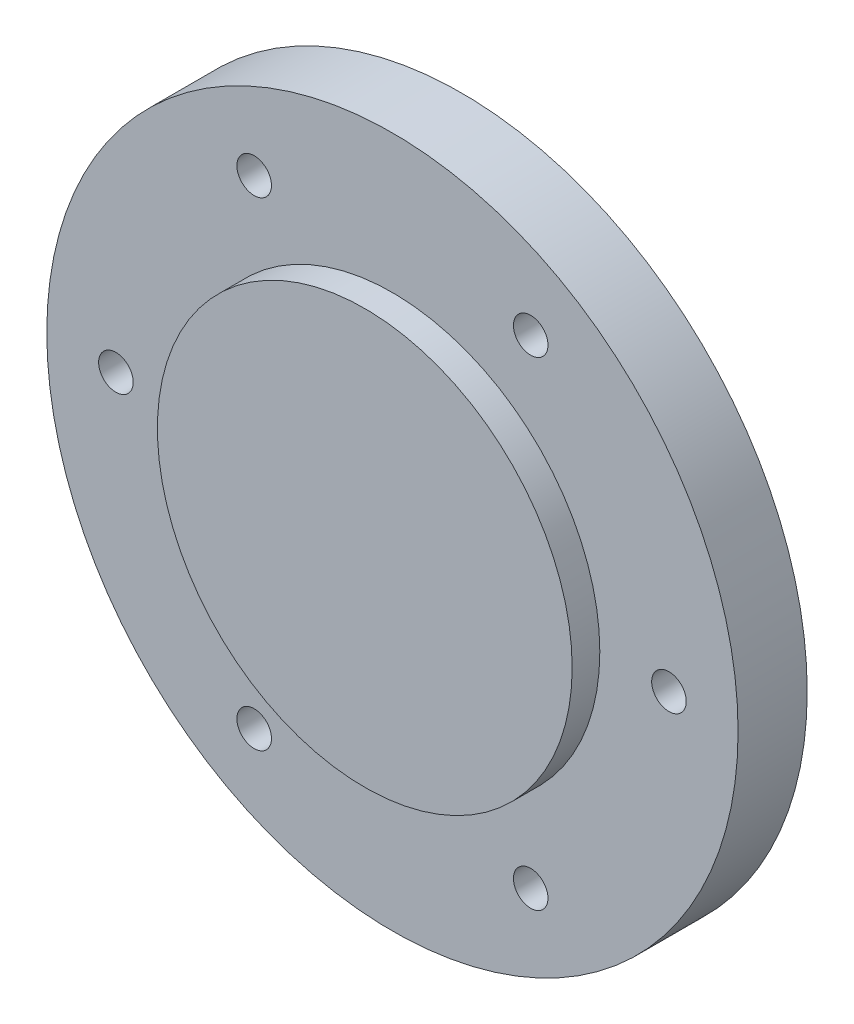
ISO-10303-21;
HEADER;
FILE_DESCRIPTION(('STEP AP214'),'2;1');
FILE_NAME('part.step','',(''),(''),'','','');
FILE_SCHEMA(('AUTOMOTIVE_DESIGN { 1 0 10303 214 1 1 1 1 }'));
ENDSEC;
DATA;
#1=APPLICATION_CONTEXT('core data for automotive mechanical design processes');
#2=APPLICATION_PROTOCOL_DEFINITION('international standard','automotive_design',2000,#1);
#3=PRODUCT_CONTEXT('',#1,'mechanical');
#4=PRODUCT('Part','Part','',(#3));
#5=PRODUCT_RELATED_PRODUCT_CATEGORY('part','',(#4));
#6=PRODUCT_DEFINITION_FORMATION('','',#4);
#7=PRODUCT_DEFINITION_CONTEXT('part definition',#1,'design');
#8=PRODUCT_DEFINITION('design','',#6,#7);
#9=PRODUCT_DEFINITION_SHAPE('','',#8);
#10=(LENGTH_UNIT() NAMED_UNIT(*) SI_UNIT(.MILLI.,.METRE.));
#11=(NAMED_UNIT(*) PLANE_ANGLE_UNIT() SI_UNIT($,.RADIAN.));
#12=(NAMED_UNIT(*) SI_UNIT($,.STERADIAN.) SOLID_ANGLE_UNIT());
#13=UNCERTAINTY_MEASURE_WITH_UNIT(LENGTH_MEASURE(1.E-05),#10,'distance_accuracy_value','');
#14=(GEOMETRIC_REPRESENTATION_CONTEXT(3) GLOBAL_UNCERTAINTY_ASSIGNED_CONTEXT((#13)) GLOBAL_UNIT_ASSIGNED_CONTEXT((#10,
#11,#12)) REPRESENTATION_CONTEXT('',''));
#15=CARTESIAN_POINT('',(0.,0.,0.));
#16=DIRECTION('',(0.,0.,1.));
#17=DIRECTION('',(1.,0.,0.));
#18=AXIS2_PLACEMENT_3D('',#15,#16,#17);
#19=CARTESIAN_POINT('',(0.,0.,5.));
#20=DIRECTION('',(0.,0.,-1.));
#21=DIRECTION('',(-1.,0.,0.));
#22=AXIS2_PLACEMENT_3D('',#19,#20,#21);
#23=CYLINDRICAL_SURFACE('',#22,25.);
#24=CARTESIAN_POINT('',(0.,0.,5.));
#25=DIRECTION('',(0.,0.,1.));
#26=DIRECTION('',(1.,0.,0.));
#27=AXIS2_PLACEMENT_3D('',#24,#25,#26);
#28=CIRCLE('',#27,25.);
#29=CARTESIAN_POINT('',(25.,0.,5.));
#30=VERTEX_POINT('',#29);
#31=EDGE_CURVE('E42',#30,#30,#28,.T.);
#32=ORIENTED_EDGE('',*,*,#31,.F.);
#33=EDGE_LOOP('',(#32));
#34=FACE_BOUND('',#33,.T.);
#35=CARTESIAN_POINT('',(0.,0.,0.));
#36=DIRECTION('',(0.,0.,1.));
#37=DIRECTION('',(1.,0.,0.));
#38=AXIS2_PLACEMENT_3D('',#35,#36,#37);
#39=CIRCLE('',#38,25.);
#40=CARTESIAN_POINT('',(25.,0.,0.));
#41=VERTEX_POINT('',#40);
#42=EDGE_CURVE('E37',#41,#41,#39,.T.);
#43=ORIENTED_EDGE('',*,*,#42,.T.);
#44=EDGE_LOOP('',(#43));
#45=FACE_BOUND('',#44,.T.);
#46=ADVANCED_FACE('F40',(#34,#45),#23,.T.);
#47=CARTESIAN_POINT('',(0.,0.,5.));
#48=DIRECTION('',(0.,0.,1.));
#49=DIRECTION('',(1.,0.,0.));
#50=AXIS2_PLACEMENT_3D('',#47,#48,#49);
#51=PLANE('',#50);
#52=CARTESIAN_POINT('',(9.99999999999999,-17.3205080756888,5.));
#53=DIRECTION('',(0.,0.,1.));
#54=DIRECTION('',(0.499999999999999,-0.866025403784439,0.));
#55=AXIS2_PLACEMENT_3D('',#52,#53,#54);
#56=CIRCLE('',#55,1.25);
#57=CARTESIAN_POINT('',(10.625,-18.4030398304193,5.));
#58=VERTEX_POINT('',#57);
#59=EDGE_CURVE('E66',#58,#58,#56,.T.);
#60=ORIENTED_EDGE('',*,*,#59,.F.);
#61=EDGE_LOOP('',(#60));
#62=FACE_BOUND('',#61,.T.);
#63=CARTESIAN_POINT('',(-10.,-17.3205080756888,5.));
#64=DIRECTION('',(0.,0.,1.));
#65=DIRECTION('',(-0.5,-0.866025403784438,0.));
#66=AXIS2_PLACEMENT_3D('',#63,#64,#65);
#67=CIRCLE('',#66,1.25);
#68=CARTESIAN_POINT('',(-10.625,-18.4030398304193,5.));
#69=VERTEX_POINT('',#68);
#70=EDGE_CURVE('E75',#69,#69,#67,.T.);
#71=ORIENTED_EDGE('',*,*,#70,.F.);
#72=EDGE_LOOP('',(#71));
#73=FACE_BOUND('',#72,.T.);
#74=CARTESIAN_POINT('',(-20.,0.,5.));
#75=DIRECTION('',(0.,0.,1.));
#76=DIRECTION('',(-1.,0.,0.));
#77=AXIS2_PLACEMENT_3D('',#74,#75,#76);
#78=CIRCLE('',#77,1.25);
#79=CARTESIAN_POINT('',(-21.25,0.,5.));
#80=VERTEX_POINT('',#79);
#81=EDGE_CURVE('E80',#80,#80,#78,.T.);
#82=ORIENTED_EDGE('',*,*,#81,.F.);
#83=EDGE_LOOP('',(#82));
#84=FACE_BOUND('',#83,.T.);
#85=CARTESIAN_POINT('',(-10.,17.3205080756888,5.));
#86=DIRECTION('',(0.,0.,1.));
#87=DIRECTION('',(-0.5,0.866025403784439,0.));
#88=AXIS2_PLACEMENT_3D('',#85,#86,#87);
#89=CIRCLE('',#88,1.25);
#90=CARTESIAN_POINT('',(-10.625,18.4030398304193,5.));
#91=VERTEX_POINT('',#90);
#92=EDGE_CURVE('E83',#91,#91,#89,.T.);
#93=ORIENTED_EDGE('',*,*,#92,.F.);
#94=EDGE_LOOP('',(#93));
#95=FACE_BOUND('',#94,.T.);
#96=CARTESIAN_POINT('',(10.,17.3205080756888,5.));
#97=DIRECTION('',(0.,0.,1.));
#98=DIRECTION('',(0.5,0.866025403784439,0.));
#99=AXIS2_PLACEMENT_3D('',#96,#97,#98);
#100=CIRCLE('',#99,1.25);
#101=CARTESIAN_POINT('',(10.625,18.4030398304193,5.));
#102=VERTEX_POINT('',#101);
#103=EDGE_CURVE('E58',#102,#102,#100,.T.);
#104=ORIENTED_EDGE('',*,*,#103,.F.);
#105=EDGE_LOOP('',(#104));
#106=FACE_BOUND('',#105,.T.);
#107=CARTESIAN_POINT('',(20.,0.,5.));
#108=DIRECTION('',(0.,0.,1.));
#109=DIRECTION('',(1.,0.,0.));
#110=AXIS2_PLACEMENT_3D('',#107,#108,#109);
#111=CIRCLE('',#110,1.25);
#112=CARTESIAN_POINT('',(21.25,0.,5.));
#113=VERTEX_POINT('',#112);
#114=EDGE_CURVE('E53',#113,#113,#111,.T.);
#115=ORIENTED_EDGE('',*,*,#114,.F.);
#116=EDGE_LOOP('',(#115));
#117=FACE_BOUND('',#116,.T.);
#118=CARTESIAN_POINT('',(0.,0.,5.));
#119=DIRECTION('',(0.,0.,1.));
#120=DIRECTION('',(1.,0.,0.));
#121=AXIS2_PLACEMENT_3D('',#118,#119,#120);
#122=CIRCLE('',#121,15.);
#123=CARTESIAN_POINT('',(15.,0.,5.));
#124=VERTEX_POINT('',#123);
#125=EDGE_CURVE('E10',#124,#124,#122,.T.);
#126=ORIENTED_EDGE('',*,*,#125,.F.);
#127=EDGE_LOOP('',(#126));
#128=FACE_BOUND('',#127,.T.);
#129=ORIENTED_EDGE('',*,*,#31,.T.);
#130=EDGE_LOOP('',(#129));
#131=FACE_BOUND('',#130,.T.);
#132=ADVANCED_FACE('F101',(#62,#73,#84,#95,#106,#117,#128,#131),#51,.T.);
#133=CARTESIAN_POINT('',(0.,0.,0.));
#134=DIRECTION('',(0.,0.,1.));
#135=DIRECTION('',(1.,0.,0.));
#136=AXIS2_PLACEMENT_3D('',#133,#134,#135);
#137=PLANE('',#136);
#138=CARTESIAN_POINT('',(9.99999999999999,-17.3205080756888,0.));
#139=DIRECTION('',(0.,0.,1.));
#140=DIRECTION('',(0.499999999999999,-0.866025403784439,0.));
#141=AXIS2_PLACEMENT_3D('',#138,#139,#140);
#142=CIRCLE('',#141,1.25);
#143=CARTESIAN_POINT('',(10.625,-18.4030398304193,0.));
#144=VERTEX_POINT('',#143);
#145=EDGE_CURVE('E68',#144,#144,#142,.T.);
#146=ORIENTED_EDGE('',*,*,#145,.T.);
#147=EDGE_LOOP('',(#146));
#148=FACE_BOUND('',#147,.T.);
#149=CARTESIAN_POINT('',(-10.,-17.3205080756888,0.));
#150=DIRECTION('',(0.,0.,1.));
#151=DIRECTION('',(-0.5,-0.866025403784438,0.));
#152=AXIS2_PLACEMENT_3D('',#149,#150,#151);
#153=CIRCLE('',#152,1.25);
#154=CARTESIAN_POINT('',(-10.625,-18.4030398304193,0.));
#155=VERTEX_POINT('',#154);
#156=EDGE_CURVE('E73',#155,#155,#153,.T.);
#157=ORIENTED_EDGE('',*,*,#156,.T.);
#158=EDGE_LOOP('',(#157));
#159=FACE_BOUND('',#158,.T.);
#160=CARTESIAN_POINT('',(-20.,0.,0.));
#161=DIRECTION('',(0.,0.,1.));
#162=DIRECTION('',(-1.,0.,0.));
#163=AXIS2_PLACEMENT_3D('',#160,#161,#162);
#164=CIRCLE('',#163,1.25);
#165=CARTESIAN_POINT('',(-21.25,0.,0.));
#166=VERTEX_POINT('',#165);
#167=EDGE_CURVE('E81',#166,#166,#164,.T.);
#168=ORIENTED_EDGE('',*,*,#167,.T.);
#169=EDGE_LOOP('',(#168));
#170=FACE_BOUND('',#169,.T.);
#171=CARTESIAN_POINT('',(-10.,17.3205080756888,0.));
#172=DIRECTION('',(0.,0.,1.));
#173=DIRECTION('',(-0.5,0.866025403784439,0.));
#174=AXIS2_PLACEMENT_3D('',#171,#172,#173);
#175=CIRCLE('',#174,1.25);
#176=CARTESIAN_POINT('',(-10.625,18.4030398304193,0.));
#177=VERTEX_POINT('',#176);
#178=EDGE_CURVE('E65',#177,#177,#175,.T.);
#179=ORIENTED_EDGE('',*,*,#178,.T.);
#180=EDGE_LOOP('',(#179));
#181=FACE_BOUND('',#180,.T.);
#182=CARTESIAN_POINT('',(10.,17.3205080756888,0.));
#183=DIRECTION('',(0.,0.,1.));
#184=DIRECTION('',(0.5,0.866025403784439,0.));
#185=AXIS2_PLACEMENT_3D('',#182,#183,#184);
#186=CIRCLE('',#185,1.25);
#187=CARTESIAN_POINT('',(10.625,18.4030398304193,0.));
#188=VERTEX_POINT('',#187);
#189=EDGE_CURVE('E60',#188,#188,#186,.T.);
#190=ORIENTED_EDGE('',*,*,#189,.T.);
#191=EDGE_LOOP('',(#190));
#192=FACE_BOUND('',#191,.T.);
#193=CARTESIAN_POINT('',(20.,0.,0.));
#194=DIRECTION('',(0.,0.,1.));
#195=DIRECTION('',(1.,0.,0.));
#196=AXIS2_PLACEMENT_3D('',#193,#194,#195);
#197=CIRCLE('',#196,1.25);
#198=CARTESIAN_POINT('',(21.25,0.,0.));
#199=VERTEX_POINT('',#198);
#200=EDGE_CURVE('E52',#199,#199,#197,.T.);
#201=ORIENTED_EDGE('',*,*,#200,.T.);
#202=EDGE_LOOP('',(#201));
#203=FACE_BOUND('',#202,.T.);
#204=ORIENTED_EDGE('',*,*,#42,.F.);
#205=EDGE_LOOP('',(#204));
#206=FACE_BOUND('',#205,.T.);
#207=ADVANCED_FACE('F89',(#148,#159,#170,#181,#192,#203,#206),#137,.F.);
#208=CARTESIAN_POINT('',(0.,0.,7.));
#209=DIRECTION('',(0.,0.,-1.));
#210=DIRECTION('',(-1.,0.,0.));
#211=AXIS2_PLACEMENT_3D('',#208,#209,#210);
#212=CYLINDRICAL_SURFACE('',#211,15.);
#213=CARTESIAN_POINT('',(0.,0.,7.));
#214=DIRECTION('',(0.,0.,1.));
#215=DIRECTION('',(1.,0.,0.));
#216=AXIS2_PLACEMENT_3D('',#213,#214,#215);
#217=CIRCLE('',#216,15.);
#218=CARTESIAN_POINT('',(15.,0.,7.));
#219=VERTEX_POINT('',#218);
#220=EDGE_CURVE('E49',#219,#219,#217,.T.);
#221=ORIENTED_EDGE('',*,*,#220,.F.);
#222=EDGE_LOOP('',(#221));
#223=FACE_BOUND('',#222,.T.);
#224=ORIENTED_EDGE('',*,*,#125,.T.);
#225=EDGE_LOOP('',(#224));
#226=FACE_BOUND('',#225,.T.);
#227=ADVANCED_FACE('F118',(#223,#226),#212,.T.);
#228=CARTESIAN_POINT('',(0.,0.,7.));
#229=DIRECTION('',(0.,0.,1.));
#230=DIRECTION('',(1.,0.,0.));
#231=AXIS2_PLACEMENT_3D('',#228,#229,#230);
#232=PLANE('',#231);
#233=ORIENTED_EDGE('',*,*,#220,.T.);
#234=EDGE_LOOP('',(#233));
#235=FACE_BOUND('',#234,.T.);
#236=ADVANCED_FACE('F125',(#235),#232,.T.);
#237=CARTESIAN_POINT('',(20.,0.,0.));
#238=DIRECTION('',(0.,0.,1.));
#239=DIRECTION('',(1.,0.,0.));
#240=AXIS2_PLACEMENT_3D('',#237,#238,#239);
#241=CYLINDRICAL_SURFACE('',#240,1.25);
#242=ORIENTED_EDGE('',*,*,#200,.F.);
#243=EDGE_LOOP('',(#242));
#244=FACE_BOUND('',#243,.T.);
#245=ORIENTED_EDGE('',*,*,#114,.T.);
#246=EDGE_LOOP('',(#245));
#247=FACE_BOUND('',#246,.T.);
#248=ADVANCED_FACE('F131',(#244,#247),#241,.F.);
#249=CARTESIAN_POINT('',(10.,17.3205080756888,0.));
#250=DIRECTION('',(0.,0.,1.));
#251=DIRECTION('',(1.,0.,0.));
#252=AXIS2_PLACEMENT_3D('',#249,#250,#251);
#253=CYLINDRICAL_SURFACE('',#252,1.25);
#254=ORIENTED_EDGE('',*,*,#189,.F.);
#255=EDGE_LOOP('',(#254));
#256=FACE_BOUND('',#255,.T.);
#257=ORIENTED_EDGE('',*,*,#103,.T.);
#258=EDGE_LOOP('',(#257));
#259=FACE_BOUND('',#258,.T.);
#260=ADVANCED_FACE('F100',(#256,#259),#253,.F.);
#261=CARTESIAN_POINT('',(-10.,17.3205080756888,0.));
#262=DIRECTION('',(0.,0.,1.));
#263=DIRECTION('',(1.,0.,0.));
#264=AXIS2_PLACEMENT_3D('',#261,#262,#263);
#265=CYLINDRICAL_SURFACE('',#264,1.25);
#266=ORIENTED_EDGE('',*,*,#178,.F.);
#267=EDGE_LOOP('',(#266));
#268=FACE_BOUND('',#267,.T.);
#269=ORIENTED_EDGE('',*,*,#92,.T.);
#270=EDGE_LOOP('',(#269));
#271=FACE_BOUND('',#270,.T.);
#272=ADVANCED_FACE('F91',(#268,#271),#265,.F.);
#273=CARTESIAN_POINT('',(-20.,0.,0.));
#274=DIRECTION('',(0.,0.,1.));
#275=DIRECTION('',(1.,0.,0.));
#276=AXIS2_PLACEMENT_3D('',#273,#274,#275);
#277=CYLINDRICAL_SURFACE('',#276,1.25);
#278=ORIENTED_EDGE('',*,*,#167,.F.);
#279=EDGE_LOOP('',(#278));
#280=FACE_BOUND('',#279,.T.);
#281=ORIENTED_EDGE('',*,*,#81,.T.);
#282=EDGE_LOOP('',(#281));
#283=FACE_BOUND('',#282,.T.);
#284=ADVANCED_FACE('F96',(#280,#283),#277,.F.);
#285=CARTESIAN_POINT('',(-10.,-17.3205080756888,0.));
#286=DIRECTION('',(0.,0.,1.));
#287=DIRECTION('',(1.,0.,0.));
#288=AXIS2_PLACEMENT_3D('',#285,#286,#287);
#289=CYLINDRICAL_SURFACE('',#288,1.25);
#290=ORIENTED_EDGE('',*,*,#156,.F.);
#291=EDGE_LOOP('',(#290));
#292=FACE_BOUND('',#291,.T.);
#293=ORIENTED_EDGE('',*,*,#70,.T.);
#294=EDGE_LOOP('',(#293));
#295=FACE_BOUND('',#294,.T.);
#296=ADVANCED_FACE('F142',(#292,#295),#289,.F.);
#297=CARTESIAN_POINT('',(9.99999999999999,-17.3205080756888,0.));
#298=DIRECTION('',(0.,0.,1.));
#299=DIRECTION('',(1.,0.,0.));
#300=AXIS2_PLACEMENT_3D('',#297,#298,#299);
#301=CYLINDRICAL_SURFACE('',#300,1.25);
#302=ORIENTED_EDGE('',*,*,#145,.F.);
#303=EDGE_LOOP('',(#302));
#304=FACE_BOUND('',#303,.T.);
#305=ORIENTED_EDGE('',*,*,#59,.T.);
#306=EDGE_LOOP('',(#305));
#307=FACE_BOUND('',#306,.T.);
#308=ADVANCED_FACE('F138',(#304,#307),#301,.F.);
#309=CLOSED_SHELL('',(#46,#132,#207,#227,#236,#248,#260,#272,#284,#296,#308));
#310=MANIFOLD_SOLID_BREP('B2',#309);
#311=ADVANCED_BREP_SHAPE_REPRESENTATION('',(#18,#310),#14);
#312=SHAPE_DEFINITION_REPRESENTATION(#9,#311);
ENDSEC;
END-ISO-10303-21;
